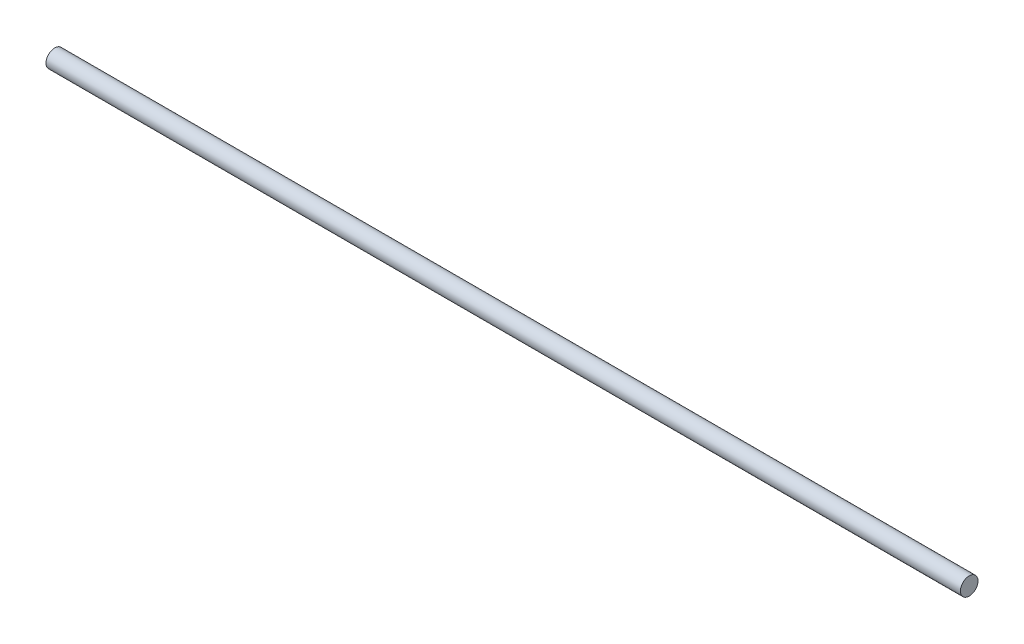
ISO-10303-21;
HEADER;
FILE_DESCRIPTION(('STEP AP214'),'2;1');
FILE_NAME('part.step','',(''),(''),'','','');
FILE_SCHEMA(('AUTOMOTIVE_DESIGN { 1 0 10303 214 1 1 1 1 }'));
ENDSEC;
DATA;
#1=APPLICATION_CONTEXT('core data for automotive mechanical design processes');
#2=APPLICATION_PROTOCOL_DEFINITION('international standard','automotive_design',2000,#1);
#3=PRODUCT_CONTEXT('',#1,'mechanical');
#4=PRODUCT('Part','Part','',(#3));
#5=PRODUCT_RELATED_PRODUCT_CATEGORY('part','',(#4));
#6=PRODUCT_DEFINITION_FORMATION('','',#4);
#7=PRODUCT_DEFINITION_CONTEXT('part definition',#1,'design');
#8=PRODUCT_DEFINITION('design','',#6,#7);
#9=PRODUCT_DEFINITION_SHAPE('','',#8);
#10=(LENGTH_UNIT() NAMED_UNIT(*) SI_UNIT(.MILLI.,.METRE.));
#11=(NAMED_UNIT(*) PLANE_ANGLE_UNIT() SI_UNIT($,.RADIAN.));
#12=(NAMED_UNIT(*) SI_UNIT($,.STERADIAN.) SOLID_ANGLE_UNIT());
#13=UNCERTAINTY_MEASURE_WITH_UNIT(LENGTH_MEASURE(1.E-05),#10,'distance_accuracy_value','');
#14=(GEOMETRIC_REPRESENTATION_CONTEXT(3) GLOBAL_UNCERTAINTY_ASSIGNED_CONTEXT((#13)) GLOBAL_UNIT_ASSIGNED_CONTEXT((#10,
#11,#12)) REPRESENTATION_CONTEXT('',''));
#15=CARTESIAN_POINT('',(0.,0.,0.));
#16=DIRECTION('',(0.,0.,1.));
#17=DIRECTION('',(1.,0.,0.));
#18=AXIS2_PLACEMENT_3D('',#15,#16,#17);
#19=CARTESIAN_POINT('',(468.,0.,0.));
#20=DIRECTION('',(-1.,0.,0.));
#21=DIRECTION('',(0.,0.,1.));
#22=AXIS2_PLACEMENT_3D('',#19,#20,#21);
#23=CYLINDRICAL_SURFACE('',#22,9.);
#24=CARTESIAN_POINT('',(468.,0.,0.));
#25=DIRECTION('',(1.,0.,0.));
#26=DIRECTION('',(0.,0.,-1.));
#27=AXIS2_PLACEMENT_3D('',#24,#25,#26);
#28=CIRCLE('',#27,9.);
#29=CARTESIAN_POINT('',(468.,0.,-9.));
#30=VERTEX_POINT('',#29);
#31=EDGE_CURVE('E10',#30,#30,#28,.T.);
#32=ORIENTED_EDGE('',*,*,#31,.F.);
#33=EDGE_LOOP('',(#32));
#34=FACE_BOUND('',#33,.T.);
#35=CARTESIAN_POINT('',(-468.,0.,0.));
#36=DIRECTION('',(1.,0.,0.));
#37=DIRECTION('',(0.,0.,-1.));
#38=AXIS2_PLACEMENT_3D('',#35,#36,#37);
#39=CIRCLE('',#38,9.);
#40=CARTESIAN_POINT('',(-468.,0.,-9.));
#41=VERTEX_POINT('',#40);
#42=EDGE_CURVE('E34',#41,#41,#39,.T.);
#43=ORIENTED_EDGE('',*,*,#42,.T.);
#44=EDGE_LOOP('',(#43));
#45=FACE_BOUND('',#44,.T.);
#46=ADVANCED_FACE('F31',(#34,#45),#23,.T.);
#47=CARTESIAN_POINT('',(468.,0.,0.));
#48=DIRECTION('',(1.,0.,0.));
#49=DIRECTION('',(0.,0.,-1.));
#50=AXIS2_PLACEMENT_3D('',#47,#48,#49);
#51=PLANE('',#50);
#52=ORIENTED_EDGE('',*,*,#31,.T.);
#53=EDGE_LOOP('',(#52));
#54=FACE_BOUND('',#53,.T.);
#55=ADVANCED_FACE('F46',(#54),#51,.T.);
#56=CARTESIAN_POINT('',(-468.,0.,0.));
#57=DIRECTION('',(1.,0.,0.));
#58=DIRECTION('',(0.,0.,-1.));
#59=AXIS2_PLACEMENT_3D('',#56,#57,#58);
#60=PLANE('',#59);
#61=ORIENTED_EDGE('',*,*,#42,.F.);
#62=EDGE_LOOP('',(#61));
#63=FACE_BOUND('',#62,.T.);
#64=ADVANCED_FACE('F44',(#63),#60,.F.);
#65=CLOSED_SHELL('',(#46,#55,#64));
#66=MANIFOLD_SOLID_BREP('B2',#65);
#67=ADVANCED_BREP_SHAPE_REPRESENTATION('',(#18,#66),#14);
#68=SHAPE_DEFINITION_REPRESENTATION(#9,#67);
ENDSEC;
END-ISO-10303-21;
